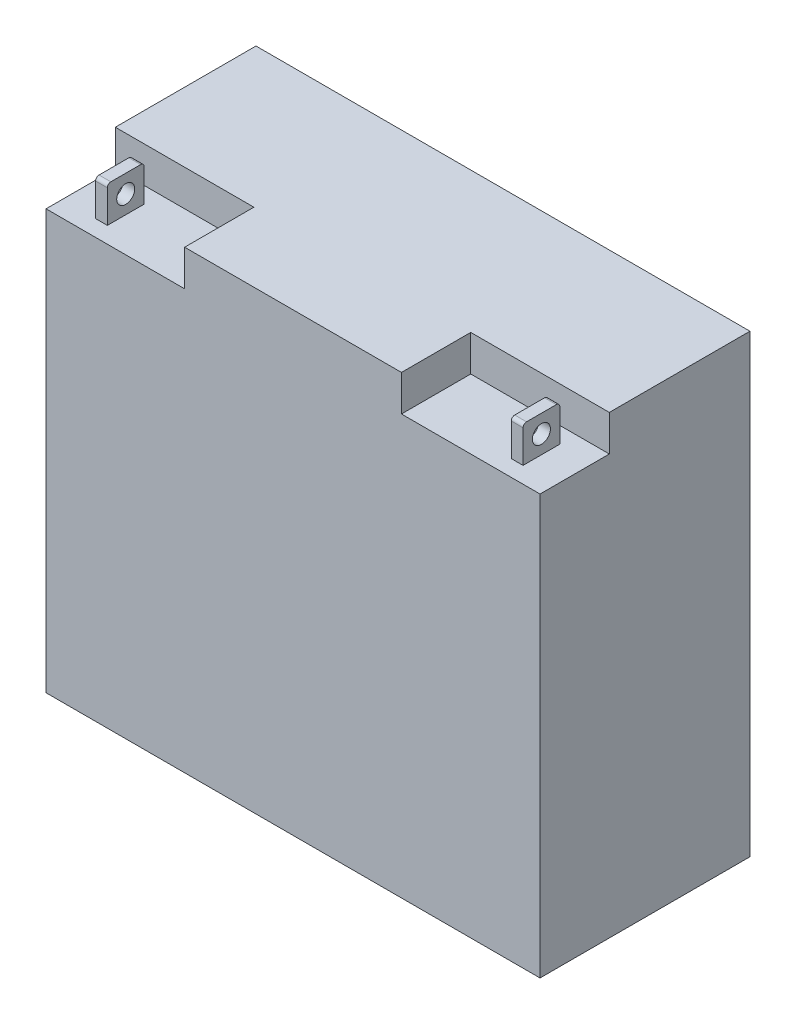
ISO-10303-21;
HEADER;
FILE_DESCRIPTION(('STEP AP214'),'2;1');
FILE_NAME('part.step','',(''),(''),'','','');
FILE_SCHEMA(('AUTOMOTIVE_DESIGN { 1 0 10303 214 1 1 1 1 }'));
ENDSEC;
DATA;
#1=APPLICATION_CONTEXT('core data for automotive mechanical design processes');
#2=APPLICATION_PROTOCOL_DEFINITION('international standard','automotive_design',2000,#1);
#3=PRODUCT_CONTEXT('',#1,'mechanical');
#4=PRODUCT('Part','Part','',(#3));
#5=PRODUCT_RELATED_PRODUCT_CATEGORY('part','',(#4));
#6=PRODUCT_DEFINITION_FORMATION('','',#4);
#7=PRODUCT_DEFINITION_CONTEXT('part definition',#1,'design');
#8=PRODUCT_DEFINITION('design','',#6,#7);
#9=PRODUCT_DEFINITION_SHAPE('','',#8);
#10=(LENGTH_UNIT() NAMED_UNIT(*) SI_UNIT(.MILLI.,.METRE.));
#11=(NAMED_UNIT(*) PLANE_ANGLE_UNIT() SI_UNIT($,.RADIAN.));
#12=(NAMED_UNIT(*) SI_UNIT($,.STERADIAN.) SOLID_ANGLE_UNIT());
#13=UNCERTAINTY_MEASURE_WITH_UNIT(LENGTH_MEASURE(1.E-05),#10,'distance_accuracy_value','');
#14=(GEOMETRIC_REPRESENTATION_CONTEXT(3) GLOBAL_UNCERTAINTY_ASSIGNED_CONTEXT((#13)) GLOBAL_UNIT_ASSIGNED_CONTEXT((#10,
#11,#12)) REPRESENTATION_CONTEXT('',''));
#15=CARTESIAN_POINT('',(0.,0.,0.));
#16=DIRECTION('',(0.,0.,1.));
#17=DIRECTION('',(1.,0.,0.));
#18=AXIS2_PLACEMENT_3D('',#15,#16,#17);
#19=CARTESIAN_POINT('',(90.551,166.878,38.481));
#20=DIRECTION('',(-1.,0.,0.));
#21=DIRECTION('',(0.,0.,1.));
#22=AXIS2_PLACEMENT_3D('',#19,#20,#21);
#23=PLANE('',#22);
#24=DIRECTION('',(0.,0.,-1.));
#25=VECTOR('',#24,1.);
#26=CARTESIAN_POINT('',(90.551,153.67,0.));
#27=LINE('',#26,#25);
#28=CARTESIAN_POINT('',(90.551,153.67,38.481));
#29=VERTEX_POINT('',#28);
#30=CARTESIAN_POINT('',(90.551,153.67,13.081));
#31=VERTEX_POINT('',#30);
#32=EDGE_CURVE('E336',#29,#31,#27,.T.);
#33=ORIENTED_EDGE('',*,*,#32,.F.);
#34=DIRECTION('',(0.,-1.,0.));
#35=VECTOR('',#34,1.);
#36=CARTESIAN_POINT('',(90.551,166.878,38.481));
#37=LINE('',#36,#35);
#38=CARTESIAN_POINT('',(90.551,0.,38.481));
#39=VERTEX_POINT('',#38);
#40=EDGE_CURVE('E359',#29,#39,#37,.T.);
#41=ORIENTED_EDGE('',*,*,#40,.T.);
#42=DIRECTION('',(0.,0.,-1.));
#43=VECTOR('',#42,1.);
#44=CARTESIAN_POINT('',(90.551,0.,38.481));
#45=LINE('',#44,#43);
#46=CARTESIAN_POINT('',(90.551,0.,-38.481));
#47=VERTEX_POINT('',#46);
#48=EDGE_CURVE('E348',#39,#47,#45,.T.);
#49=ORIENTED_EDGE('',*,*,#48,.T.);
#50=DIRECTION('',(0.,-1.,0.));
#51=VECTOR('',#50,1.);
#52=CARTESIAN_POINT('',(90.551,166.878,-38.481));
#53=LINE('',#52,#51);
#54=CARTESIAN_POINT('',(90.551,166.878,-38.481));
#55=VERTEX_POINT('',#54);
#56=EDGE_CURVE('E368',#55,#47,#53,.T.);
#57=ORIENTED_EDGE('',*,*,#56,.F.);
#58=DIRECTION('',(0.,0.,-1.));
#59=VECTOR('',#58,1.);
#60=CARTESIAN_POINT('',(90.551,166.878,38.481));
#61=LINE('',#60,#59);
#62=CARTESIAN_POINT('',(90.551,166.878,13.081));
#63=VERTEX_POINT('',#62);
#64=EDGE_CURVE('E355',#63,#55,#61,.T.);
#65=ORIENTED_EDGE('',*,*,#64,.F.);
#66=DIRECTION('',(0.,1.,0.));
#67=VECTOR('',#66,1.);
#68=CARTESIAN_POINT('',(90.551,153.67,13.081));
#69=LINE('',#68,#67);
#70=EDGE_CURVE('E341',#31,#63,#69,.T.);
#71=ORIENTED_EDGE('',*,*,#70,.F.);
#72=EDGE_LOOP('',(#33,#41,#49,#57,#65,#71));
#73=FACE_BOUND('',#72,.T.);
#74=ADVANCED_FACE('F50',(#73),#23,.F.);
#75=CARTESIAN_POINT('',(0.,166.878,0.));
#76=DIRECTION('',(0.,-1.,0.));
#77=DIRECTION('',(0.,0.,-1.));
#78=AXIS2_PLACEMENT_3D('',#75,#76,#77);
#79=PLANE('',#78);
#80=DIRECTION('',(-1.,0.,0.));
#81=VECTOR('',#80,1.);
#82=CARTESIAN_POINT('',(0.,166.878,13.081));
#83=LINE('',#82,#81);
#84=CARTESIAN_POINT('',(39.751,166.878,13.081));
#85=VERTEX_POINT('',#84);
#86=EDGE_CURVE('E326',#63,#85,#83,.T.);
#87=ORIENTED_EDGE('',*,*,#86,.F.);
#88=ORIENTED_EDGE('',*,*,#64,.T.);
#89=DIRECTION('',(-1.,0.,0.));
#90=VECTOR('',#89,1.);
#91=CARTESIAN_POINT('',(-90.551,166.878,-38.481));
#92=LINE('',#91,#90);
#93=CARTESIAN_POINT('',(-90.5509999999999,166.878,-38.4810000000001));
#94=VERTEX_POINT('',#93);
#95=EDGE_CURVE('E353',#55,#94,#92,.T.);
#96=ORIENTED_EDGE('',*,*,#95,.T.);
#97=DIRECTION('',(0.,0.,-1.));
#98=VECTOR('',#97,1.);
#99=CARTESIAN_POINT('',(-90.551,166.878,38.4809999999999));
#100=LINE('',#99,#98);
#101=CARTESIAN_POINT('',(-90.551,166.878,13.0809999999999));
#102=VERTEX_POINT('',#101);
#103=EDGE_CURVE('E267',#102,#94,#100,.T.);
#104=ORIENTED_EDGE('',*,*,#103,.F.);
#105=DIRECTION('',(1.,0.,0.));
#106=VECTOR('',#105,1.);
#107=CARTESIAN_POINT('',(0.,166.878,13.081));
#108=LINE('',#107,#106);
#109=CARTESIAN_POINT('',(-39.751,166.878,13.081));
#110=VERTEX_POINT('',#109);
#111=EDGE_CURVE('E208',#102,#110,#108,.T.);
#112=ORIENTED_EDGE('',*,*,#111,.T.);
#113=DIRECTION('',(0.,0.,1.));
#114=VECTOR('',#113,1.);
#115=CARTESIAN_POINT('',(-39.751,166.878,0.));
#116=LINE('',#115,#114);
#117=CARTESIAN_POINT('',(-39.751,166.878,38.481));
#118=VERTEX_POINT('',#117);
#119=EDGE_CURVE('E247',#110,#118,#116,.T.);
#120=ORIENTED_EDGE('',*,*,#119,.T.);
#121=DIRECTION('',(1.,0.,0.));
#122=VECTOR('',#121,1.);
#123=CARTESIAN_POINT('',(-90.551,166.878,38.481));
#124=LINE('',#123,#122);
#125=CARTESIAN_POINT('',(39.751,166.878,38.481));
#126=VERTEX_POINT('',#125);
#127=EDGE_CURVE('E357',#118,#126,#124,.T.);
#128=ORIENTED_EDGE('',*,*,#127,.T.);
#129=DIRECTION('',(0.,0.,1.));
#130=VECTOR('',#129,1.);
#131=CARTESIAN_POINT('',(39.751,166.878,0.));
#132=LINE('',#131,#130);
#133=EDGE_CURVE('E332',#85,#126,#132,.T.);
#134=ORIENTED_EDGE('',*,*,#133,.F.);
#135=EDGE_LOOP('',(#87,#88,#96,#104,#112,#120,#128,#134));
#136=FACE_BOUND('',#135,.T.);
#137=ADVANCED_FACE('F420',(#136),#79,.F.);
#138=CARTESIAN_POINT('',(-90.551,166.878,38.481));
#139=DIRECTION('',(0.,0.,-1.));
#140=DIRECTION('',(-1.,0.,0.));
#141=AXIS2_PLACEMENT_3D('',#138,#139,#140);
#142=PLANE('',#141);
#143=DIRECTION('',(1.,0.,0.));
#144=VECTOR('',#143,1.);
#145=CARTESIAN_POINT('',(0.,153.67,38.481));
#146=LINE('',#145,#144);
#147=CARTESIAN_POINT('',(39.751,153.67,38.481));
#148=VERTEX_POINT('',#147);
#149=EDGE_CURVE('E337',#148,#29,#146,.T.);
#150=ORIENTED_EDGE('',*,*,#149,.F.);
#151=DIRECTION('',(0.,1.,0.));
#152=VECTOR('',#151,1.);
#153=CARTESIAN_POINT('',(39.751,153.67,38.481));
#154=LINE('',#153,#152);
#155=EDGE_CURVE('E350',#148,#126,#154,.T.);
#156=ORIENTED_EDGE('',*,*,#155,.T.);
#157=ORIENTED_EDGE('',*,*,#127,.F.);
#158=DIRECTION('',(0.,1.,0.));
#159=VECTOR('',#158,1.);
#160=CARTESIAN_POINT('',(-39.751,153.67,38.481));
#161=LINE('',#160,#159);
#162=CARTESIAN_POINT('',(-39.751,153.67,38.481));
#163=VERTEX_POINT('',#162);
#164=EDGE_CURVE('E262',#163,#118,#161,.T.);
#165=ORIENTED_EDGE('',*,*,#164,.F.);
#166=DIRECTION('',(-1.,0.,0.));
#167=VECTOR('',#166,1.);
#168=CARTESIAN_POINT('',(0.,153.67,38.481));
#169=LINE('',#168,#167);
#170=CARTESIAN_POINT('',(-90.551,153.67,38.4809999999999));
#171=VERTEX_POINT('',#170);
#172=EDGE_CURVE('E249',#163,#171,#169,.T.);
#173=ORIENTED_EDGE('',*,*,#172,.T.);
#174=DIRECTION('',(0.,-1.,0.));
#175=VECTOR('',#174,1.);
#176=CARTESIAN_POINT('',(-90.551,166.878,38.4809999999999));
#177=LINE('',#176,#175);
#178=CARTESIAN_POINT('',(-90.551,0.,38.4809999999999));
#179=VERTEX_POINT('',#178);
#180=EDGE_CURVE('E272',#171,#179,#177,.T.);
#181=ORIENTED_EDGE('',*,*,#180,.T.);
#182=DIRECTION('',(1.,0.,0.));
#183=VECTOR('',#182,1.);
#184=CARTESIAN_POINT('',(-90.551,0.,38.481));
#185=LINE('',#184,#183);
#186=EDGE_CURVE('E354',#179,#39,#185,.T.);
#187=ORIENTED_EDGE('',*,*,#186,.T.);
#188=ORIENTED_EDGE('',*,*,#40,.F.);
#189=EDGE_LOOP('',(#150,#156,#157,#165,#173,#181,#187,#188));
#190=FACE_BOUND('',#189,.T.);
#191=ADVANCED_FACE('F428',(#190),#142,.F.);
#192=CARTESIAN_POINT('',(-90.551,166.878,-38.481));
#193=DIRECTION('',(0.,0.,1.));
#194=DIRECTION('',(1.,0.,0.));
#195=AXIS2_PLACEMENT_3D('',#192,#193,#194);
#196=PLANE('',#195);
#197=DIRECTION('',(-1.,0.,0.));
#198=VECTOR('',#197,1.);
#199=CARTESIAN_POINT('',(-90.551,0.,-38.481));
#200=LINE('',#199,#198);
#201=CARTESIAN_POINT('',(-90.5509999999999,0.,-38.4810000000001));
#202=VERTEX_POINT('',#201);
#203=EDGE_CURVE('E361',#47,#202,#200,.T.);
#204=ORIENTED_EDGE('',*,*,#203,.T.);
#205=DIRECTION('',(0.,-1.,0.));
#206=VECTOR('',#205,1.);
#207=CARTESIAN_POINT('',(-90.5509999999999,166.878,-38.4810000000001));
#208=LINE('',#207,#206);
#209=EDGE_CURVE('E277',#94,#202,#208,.T.);
#210=ORIENTED_EDGE('',*,*,#209,.F.);
#211=ORIENTED_EDGE('',*,*,#95,.F.);
#212=ORIENTED_EDGE('',*,*,#56,.T.);
#213=EDGE_LOOP('',(#204,#210,#211,#212));
#214=FACE_BOUND('',#213,.T.);
#215=ADVANCED_FACE('F431',(#214),#196,.F.);
#216=CARTESIAN_POINT('',(0.,0.,0.));
#217=DIRECTION('',(0.,-1.,0.));
#218=DIRECTION('',(0.,0.,-1.));
#219=AXIS2_PLACEMENT_3D('',#216,#217,#218);
#220=PLANE('',#219);
#221=ORIENTED_EDGE('',*,*,#186,.F.);
#222=DIRECTION('',(0.,0.,-1.));
#223=VECTOR('',#222,1.);
#224=CARTESIAN_POINT('',(-90.551,0.,38.4809999999999));
#225=LINE('',#224,#223);
#226=EDGE_CURVE('E261',#179,#202,#225,.T.);
#227=ORIENTED_EDGE('',*,*,#226,.T.);
#228=ORIENTED_EDGE('',*,*,#203,.F.);
#229=ORIENTED_EDGE('',*,*,#48,.F.);
#230=EDGE_LOOP('',(#221,#227,#228,#229));
#231=FACE_BOUND('',#230,.T.);
#232=ADVANCED_FACE('F432',(#231),#220,.T.);
#233=CARTESIAN_POINT('',(0.,153.67,13.081));
#234=DIRECTION('',(0.,0.,-1.));
#235=DIRECTION('',(-1.,0.,0.));
#236=AXIS2_PLACEMENT_3D('',#233,#234,#235);
#237=PLANE('',#236);
#238=ORIENTED_EDGE('',*,*,#86,.T.);
#239=DIRECTION('',(0.,1.,0.));
#240=VECTOR('',#239,1.);
#241=CARTESIAN_POINT('',(39.751,153.67,13.081));
#242=LINE('',#241,#240);
#243=CARTESIAN_POINT('',(39.751,153.67,13.081));
#244=VERTEX_POINT('',#243);
#245=EDGE_CURVE('E342',#244,#85,#242,.T.);
#246=ORIENTED_EDGE('',*,*,#245,.F.);
#247=DIRECTION('',(-1.,0.,0.));
#248=VECTOR('',#247,1.);
#249=CARTESIAN_POINT('',(0.,153.67,13.081));
#250=LINE('',#249,#248);
#251=EDGE_CURVE('E327',#31,#244,#250,.T.);
#252=ORIENTED_EDGE('',*,*,#251,.F.);
#253=ORIENTED_EDGE('',*,*,#70,.T.);
#254=EDGE_LOOP('',(#238,#246,#252,#253));
#255=FACE_BOUND('',#254,.T.);
#256=ADVANCED_FACE('F439',(#255),#237,.F.);
#257=CARTESIAN_POINT('',(39.751,153.67,0.));
#258=DIRECTION('',(-1.,0.,0.));
#259=DIRECTION('',(0.,0.,1.));
#260=AXIS2_PLACEMENT_3D('',#257,#258,#259);
#261=PLANE('',#260);
#262=ORIENTED_EDGE('',*,*,#133,.T.);
#263=ORIENTED_EDGE('',*,*,#155,.F.);
#264=DIRECTION('',(0.,0.,1.));
#265=VECTOR('',#264,1.);
#266=CARTESIAN_POINT('',(39.751,153.67,0.));
#267=LINE('',#266,#265);
#268=EDGE_CURVE('E334',#244,#148,#267,.T.);
#269=ORIENTED_EDGE('',*,*,#268,.F.);
#270=ORIENTED_EDGE('',*,*,#245,.T.);
#271=EDGE_LOOP('',(#262,#263,#269,#270));
#272=FACE_BOUND('',#271,.T.);
#273=ADVANCED_FACE('F444',(#272),#261,.F.);
#274=CARTESIAN_POINT('',(0.,153.67,0.));
#275=DIRECTION('',(0.,1.,0.));
#276=DIRECTION('',(0.,0.,1.));
#277=AXIS2_PLACEMENT_3D('',#274,#275,#276);
#278=PLANE('',#277);
#279=DIRECTION('',(0.,0.,-1.));
#280=VECTOR('',#279,1.);
#281=CARTESIAN_POINT('',(74.041,153.67,0.));
#282=LINE('',#281,#280);
#283=CARTESIAN_POINT('',(74.041,153.67,32.512));
#284=VERTEX_POINT('',#283);
#285=CARTESIAN_POINT('',(74.041,153.67,19.05));
#286=VERTEX_POINT('',#285);
#287=EDGE_CURVE('E305',#284,#286,#282,.T.);
#288=ORIENTED_EDGE('',*,*,#287,.T.);
#289=DIRECTION('',(-1.,0.,0.));
#290=VECTOR('',#289,1.);
#291=CARTESIAN_POINT('',(0.,153.67,19.0500000000001));
#292=LINE('',#291,#290);
#293=CARTESIAN_POINT('',(78.359,153.67,19.05));
#294=VERTEX_POINT('',#293);
#295=EDGE_CURVE('E310',#294,#286,#292,.T.);
#296=ORIENTED_EDGE('',*,*,#295,.F.);
#297=DIRECTION('',(0.,0.,-1.));
#298=VECTOR('',#297,1.);
#299=CARTESIAN_POINT('',(78.359,153.67,0.));
#300=LINE('',#299,#298);
#301=CARTESIAN_POINT('',(78.359,153.67,32.512));
#302=VERTEX_POINT('',#301);
#303=EDGE_CURVE('E317',#302,#294,#300,.T.);
#304=ORIENTED_EDGE('',*,*,#303,.F.);
#305=DIRECTION('',(-1.,0.,0.));
#306=VECTOR('',#305,1.);
#307=CARTESIAN_POINT('',(0.,153.67,32.512));
#308=LINE('',#307,#306);
#309=EDGE_CURVE('E312',#302,#284,#308,.T.);
#310=ORIENTED_EDGE('',*,*,#309,.T.);
#311=EDGE_LOOP('',(#288,#296,#304,#310));
#312=FACE_BOUND('',#311,.T.);
#313=ORIENTED_EDGE('',*,*,#251,.T.);
#314=ORIENTED_EDGE('',*,*,#268,.T.);
#315=ORIENTED_EDGE('',*,*,#149,.T.);
#316=ORIENTED_EDGE('',*,*,#32,.T.);
#317=EDGE_LOOP('',(#313,#314,#315,#316));
#318=FACE_BOUND('',#317,.T.);
#319=ADVANCED_FACE('F399',(#312,#318),#278,.T.);
#320=CARTESIAN_POINT('',(74.041,166.878,0.));
#321=DIRECTION('',(-1.,0.,0.));
#322=DIRECTION('',(0.,0.,1.));
#323=AXIS2_PLACEMENT_3D('',#320,#321,#322);
#324=PLANE('',#323);
#325=CARTESIAN_POINT('',(74.041,160.274,25.781));
#326=DIRECTION('',(-1.,0.,0.));
#327=DIRECTION('',(0.,0.,1.));
#328=AXIS2_PLACEMENT_3D('',#325,#326,#327);
#329=CIRCLE('',#328,3.30199999999999);
#330=CARTESIAN_POINT('',(74.041,160.274,22.479));
#331=VERTEX_POINT('',#330);
#332=EDGE_CURVE('E299',#331,#331,#329,.T.);
#333=ORIENTED_EDGE('',*,*,#332,.F.);
#334=EDGE_LOOP('',(#333));
#335=FACE_BOUND('',#334,.T.);
#336=DIRECTION('',(0.,0.,-1.));
#337=VECTOR('',#336,1.);
#338=CARTESIAN_POINT('',(74.041,166.878,0.));
#339=LINE('',#338,#337);
#340=CARTESIAN_POINT('',(74.041,166.878,31.242));
#341=VERTEX_POINT('',#340);
#342=CARTESIAN_POINT('',(74.041,166.878,20.32));
#343=VERTEX_POINT('',#342);
#344=EDGE_CURVE('E303',#341,#343,#339,.T.);
#345=ORIENTED_EDGE('',*,*,#344,.T.);
#346=CARTESIAN_POINT('',(74.041,165.608,20.32));
#347=DIRECTION('',(-1.,0.,0.));
#348=DIRECTION('',(0.,0.,1.));
#349=AXIS2_PLACEMENT_3D('',#346,#347,#348);
#350=CIRCLE('',#349,1.27);
#351=CARTESIAN_POINT('',(74.041,165.608,19.05));
#352=VERTEX_POINT('',#351);
#353=EDGE_CURVE('E377',#343,#352,#350,.T.);
#354=ORIENTED_EDGE('',*,*,#353,.T.);
#355=DIRECTION('',(0.,-1.,0.));
#356=VECTOR('',#355,1.);
#357=CARTESIAN_POINT('',(74.041,166.878,19.05));
#358=LINE('',#357,#356);
#359=EDGE_CURVE('E309',#352,#286,#358,.T.);
#360=ORIENTED_EDGE('',*,*,#359,.T.);
#361=ORIENTED_EDGE('',*,*,#287,.F.);
#362=DIRECTION('',(0.,-1.,0.));
#363=VECTOR('',#362,1.);
#364=CARTESIAN_POINT('',(74.041,166.878,32.512));
#365=LINE('',#364,#363);
#366=CARTESIAN_POINT('',(74.041,165.608,32.512));
#367=VERTEX_POINT('',#366);
#368=EDGE_CURVE('E328',#367,#284,#365,.T.);
#369=ORIENTED_EDGE('',*,*,#368,.F.);
#370=CARTESIAN_POINT('',(74.041,165.608,31.242));
#371=DIRECTION('',(-1.,0.,0.));
#372=DIRECTION('',(0.,0.,1.));
#373=AXIS2_PLACEMENT_3D('',#370,#371,#372);
#374=CIRCLE('',#373,1.27);
#375=EDGE_CURVE('E376',#367,#341,#374,.T.);
#376=ORIENTED_EDGE('',*,*,#375,.T.);
#377=EDGE_LOOP('',(#345,#354,#360,#361,#369,#376));
#378=FACE_BOUND('',#377,.T.);
#379=ADVANCED_FACE('F393',(#335,#378),#324,.T.);
#380=CARTESIAN_POINT('',(0.,166.878,32.512));
#381=DIRECTION('',(0.,0.,1.));
#382=DIRECTION('',(1.,0.,0.));
#383=AXIS2_PLACEMENT_3D('',#380,#381,#382);
#384=PLANE('',#383);
#385=DIRECTION('',(0.,-1.,0.));
#386=VECTOR('',#385,1.);
#387=CARTESIAN_POINT('',(78.359,166.878,32.512));
#388=LINE('',#387,#386);
#389=CARTESIAN_POINT('',(78.359,165.608,32.512));
#390=VERTEX_POINT('',#389);
#391=EDGE_CURVE('E321',#390,#302,#388,.T.);
#392=ORIENTED_EDGE('',*,*,#391,.F.);
#393=DIRECTION('',(-1.,0.,0.));
#394=VECTOR('',#393,1.);
#395=CARTESIAN_POINT('',(0.,165.608,32.512));
#396=LINE('',#395,#394);
#397=EDGE_CURVE('E11',#390,#367,#396,.T.);
#398=ORIENTED_EDGE('',*,*,#397,.T.);
#399=ORIENTED_EDGE('',*,*,#368,.T.);
#400=ORIENTED_EDGE('',*,*,#309,.F.);
#401=EDGE_LOOP('',(#392,#398,#399,#400));
#402=FACE_BOUND('',#401,.T.);
#403=ADVANCED_FACE('F405',(#402),#384,.T.);
#404=CARTESIAN_POINT('',(78.359,166.878,0.));
#405=DIRECTION('',(-1.,0.,0.));
#406=DIRECTION('',(0.,0.,1.));
#407=AXIS2_PLACEMENT_3D('',#404,#405,#406);
#408=PLANE('',#407);
#409=CARTESIAN_POINT('',(78.359,160.274,25.781));
#410=DIRECTION('',(1.,0.,0.));
#411=DIRECTION('',(0.,0.,-1.));
#412=AXIS2_PLACEMENT_3D('',#409,#410,#411);
#413=CIRCLE('',#412,3.30199999999999);
#414=CARTESIAN_POINT('',(78.359,160.274,22.479));
#415=VERTEX_POINT('',#414);
#416=EDGE_CURVE('E298',#415,#415,#413,.T.);
#417=ORIENTED_EDGE('',*,*,#416,.F.);
#418=EDGE_LOOP('',(#417));
#419=FACE_BOUND('',#418,.T.);
#420=DIRECTION('',(0.,-1.,0.));
#421=VECTOR('',#420,1.);
#422=CARTESIAN_POINT('',(78.359,166.878,19.05));
#423=LINE('',#422,#421);
#424=CARTESIAN_POINT('',(78.359,165.608,19.05));
#425=VERTEX_POINT('',#424);
#426=EDGE_CURVE('E325',#425,#294,#423,.T.);
#427=ORIENTED_EDGE('',*,*,#426,.F.);
#428=CARTESIAN_POINT('',(78.359,165.608,20.32));
#429=DIRECTION('',(-1.,0.,0.));
#430=DIRECTION('',(0.,0.,1.));
#431=AXIS2_PLACEMENT_3D('',#428,#429,#430);
#432=CIRCLE('',#431,1.27);
#433=CARTESIAN_POINT('',(78.359,166.878,20.32));
#434=VERTEX_POINT('',#433);
#435=EDGE_CURVE('E54',#425,#434,#432,.F.);
#436=ORIENTED_EDGE('',*,*,#435,.T.);
#437=DIRECTION('',(0.,0.,-1.));
#438=VECTOR('',#437,1.);
#439=CARTESIAN_POINT('',(78.359,166.878,0.));
#440=LINE('',#439,#438);
#441=CARTESIAN_POINT('',(78.359,166.878,31.242));
#442=VERTEX_POINT('',#441);
#443=EDGE_CURVE('E306',#442,#434,#440,.T.);
#444=ORIENTED_EDGE('',*,*,#443,.F.);
#445=CARTESIAN_POINT('',(78.359,165.608,31.242));
#446=DIRECTION('',(-1.,0.,0.));
#447=DIRECTION('',(0.,0.,1.));
#448=AXIS2_PLACEMENT_3D('',#445,#446,#447);
#449=CIRCLE('',#448,1.27);
#450=EDGE_CURVE('E65',#442,#390,#449,.F.);
#451=ORIENTED_EDGE('',*,*,#450,.T.);
#452=ORIENTED_EDGE('',*,*,#391,.T.);
#453=ORIENTED_EDGE('',*,*,#303,.T.);
#454=EDGE_LOOP('',(#427,#436,#444,#451,#452,#453));
#455=FACE_BOUND('',#454,.T.);
#456=ADVANCED_FACE('F385',(#419,#455),#408,.F.);
#457=CARTESIAN_POINT('',(0.,166.878,19.0500000000001));
#458=DIRECTION('',(0.,0.,1.));
#459=DIRECTION('',(1.,0.,0.));
#460=AXIS2_PLACEMENT_3D('',#457,#458,#459);
#461=PLANE('',#460);
#462=ORIENTED_EDGE('',*,*,#359,.F.);
#463=DIRECTION('',(-1.,0.,0.));
#464=VECTOR('',#463,1.);
#465=CARTESIAN_POINT('',(78.359,165.608,19.05));
#466=LINE('',#465,#464);
#467=EDGE_CURVE('E69',#352,#425,#466,.F.);
#468=ORIENTED_EDGE('',*,*,#467,.T.);
#469=ORIENTED_EDGE('',*,*,#426,.T.);
#470=ORIENTED_EDGE('',*,*,#295,.T.);
#471=EDGE_LOOP('',(#462,#468,#469,#470));
#472=FACE_BOUND('',#471,.T.);
#473=ADVANCED_FACE('F391',(#472),#461,.F.);
#474=CARTESIAN_POINT('',(0.,166.878,0.));
#475=DIRECTION('',(0.,1.,0.));
#476=DIRECTION('',(0.,0.,1.));
#477=AXIS2_PLACEMENT_3D('',#474,#475,#476);
#478=PLANE('',#477);
#479=ORIENTED_EDGE('',*,*,#443,.T.);
#480=DIRECTION('',(-1.,0.,0.));
#481=VECTOR('',#480,1.);
#482=CARTESIAN_POINT('',(74.041,166.878,20.32));
#483=LINE('',#482,#481);
#484=EDGE_CURVE('E373',#434,#343,#483,.T.);
#485=ORIENTED_EDGE('',*,*,#484,.T.);
#486=ORIENTED_EDGE('',*,*,#344,.F.);
#487=DIRECTION('',(-1.,0.,0.));
#488=VECTOR('',#487,1.);
#489=CARTESIAN_POINT('',(0.,166.878,31.242));
#490=LINE('',#489,#488);
#491=EDGE_CURVE('E371',#341,#442,#490,.F.);
#492=ORIENTED_EDGE('',*,*,#491,.T.);
#493=EDGE_LOOP('',(#479,#485,#486,#492));
#494=FACE_BOUND('',#493,.T.);
#495=ADVANCED_FACE('F387',(#494),#478,.T.);
#496=CARTESIAN_POINT('',(65.151,160.274,25.781));
#497=DIRECTION('',(1.,0.,0.));
#498=DIRECTION('',(0.,0.,-1.));
#499=AXIS2_PLACEMENT_3D('',#496,#497,#498);
#500=CYLINDRICAL_SURFACE('',#499,3.30199999999999);
#501=CARTESIAN_POINT('',(74.041,160.274,22.479));
#502=CARTESIAN_POINT('',(74.0859791666667,160.274,22.479));
#503=CARTESIAN_POINT('',(74.1309583333333,160.274,22.479));
#504=CARTESIAN_POINT('',(74.2209166666667,160.274,22.479));
#505=CARTESIAN_POINT('',(74.2658958333333,160.274,22.479));
#506=CARTESIAN_POINT('',(74.3558541666667,160.274,22.479));
#507=CARTESIAN_POINT('',(74.4008333333334,160.274,22.479));
#508=CARTESIAN_POINT('',(74.4907916666667,160.274,22.479));
#509=CARTESIAN_POINT('',(74.5357708333333,160.274,22.479));
#510=CARTESIAN_POINT('',(74.6257291666667,160.274,22.479));
#511=CARTESIAN_POINT('',(74.6707083333334,160.274,22.479));
#512=CARTESIAN_POINT('',(74.7606666666667,160.274,22.479));
#513=CARTESIAN_POINT('',(74.8056458333333,160.274,22.479));
#514=CARTESIAN_POINT('',(74.8956041666667,160.274,22.479));
#515=CARTESIAN_POINT('',(74.9405833333334,160.274,22.479));
#516=CARTESIAN_POINT('',(75.0305416666667,160.274,22.479));
#517=CARTESIAN_POINT('',(75.0755208333333,160.274,22.479));
#518=CARTESIAN_POINT('',(75.1654791666667,160.274,22.479));
#519=CARTESIAN_POINT('',(75.2104583333333,160.274,22.479));
#520=CARTESIAN_POINT('',(75.3004166666667,160.274,22.479));
#521=CARTESIAN_POINT('',(75.3453958333333,160.274,22.479));
#522=CARTESIAN_POINT('',(75.4353541666667,160.274,22.479));
#523=CARTESIAN_POINT('',(75.4803333333333,160.274,22.479));
#524=CARTESIAN_POINT('',(75.5702916666667,160.274,22.479));
#525=CARTESIAN_POINT('',(75.6152708333333,160.274,22.479));
#526=CARTESIAN_POINT('',(75.7052291666667,160.274,22.479));
#527=CARTESIAN_POINT('',(75.7502083333333,160.274,22.479));
#528=CARTESIAN_POINT('',(75.8401666666667,160.274,22.479));
#529=CARTESIAN_POINT('',(75.8851458333334,160.274,22.479));
#530=CARTESIAN_POINT('',(75.9751041666667,160.274,22.479));
#531=CARTESIAN_POINT('',(76.0200833333333,160.274,22.479));
#532=CARTESIAN_POINT('',(76.1100416666667,160.274,22.479));
#533=CARTESIAN_POINT('',(76.1550208333333,160.274,22.479));
#534=CARTESIAN_POINT('',(76.2449791666667,160.274,22.479));
#535=CARTESIAN_POINT('',(76.2899583333333,160.274,22.479));
#536=CARTESIAN_POINT('',(76.3799166666667,160.274,22.479));
#537=CARTESIAN_POINT('',(76.4248958333333,160.274,22.479));
#538=CARTESIAN_POINT('',(76.5148541666667,160.274,22.479));
#539=CARTESIAN_POINT('',(76.5598333333333,160.274,22.479));
#540=CARTESIAN_POINT('',(76.6497916666667,160.274,22.479));
#541=CARTESIAN_POINT('',(76.6947708333333,160.274,22.479));
#542=CARTESIAN_POINT('',(76.7847291666667,160.274,22.479));
#543=CARTESIAN_POINT('',(76.8297083333333,160.274,22.479));
#544=CARTESIAN_POINT('',(76.9196666666667,160.274,22.479));
#545=CARTESIAN_POINT('',(76.9646458333333,160.274,22.479));
#546=CARTESIAN_POINT('',(77.0546041666667,160.274,22.479));
#547=CARTESIAN_POINT('',(77.0995833333333,160.274,22.479));
#548=CARTESIAN_POINT('',(77.1895416666667,160.274,22.479));
#549=CARTESIAN_POINT('',(77.2345208333333,160.274,22.479));
#550=CARTESIAN_POINT('',(77.3244791666667,160.274,22.479));
#551=CARTESIAN_POINT('',(77.3694583333333,160.274,22.479));
#552=CARTESIAN_POINT('',(77.4594166666667,160.274,22.479));
#553=CARTESIAN_POINT('',(77.5043958333333,160.274,22.479));
#554=CARTESIAN_POINT('',(77.5943541666667,160.274,22.479));
#555=CARTESIAN_POINT('',(77.6393333333333,160.274,22.479));
#556=CARTESIAN_POINT('',(77.7292916666667,160.274,22.479));
#557=CARTESIAN_POINT('',(77.7742708333333,160.274,22.479));
#558=CARTESIAN_POINT('',(77.8642291666667,160.274,22.479));
#559=CARTESIAN_POINT('',(77.9092083333333,160.274,22.479));
#560=CARTESIAN_POINT('',(77.9991666666667,160.274,22.479));
#561=CARTESIAN_POINT('',(78.0441458333333,160.274,22.479));
#562=CARTESIAN_POINT('',(78.1341041666667,160.274,22.479));
#563=CARTESIAN_POINT('',(78.1790833333333,160.274,22.479));
#564=CARTESIAN_POINT('',(78.2690416666667,160.274,22.479));
#565=CARTESIAN_POINT('',(78.3140208333333,160.274,22.479));
#566=CARTESIAN_POINT('',(78.359,160.274,22.479));
#567=B_SPLINE_CURVE_WITH_KNOTS('',3,(#501,#502,#503,#504,#505,#506,#507,#508,#509,#510,#511,
#512,#513,#514,#515,#516,#517,#518,#519,#520,#521,#522,#523,#524,#525,#526,#527,#528,#529,#530,
#531,#532,#533,#534,#535,#536,#537,#538,#539,#540,#541,#542,#543,#544,#545,#546,#547,#548,#549,
#550,#551,#552,#553,#554,#555,#556,#557,#558,#559,#560,#561,#562,#563,#564,#565,#566),
.UNSPECIFIED.,.F.,.F.,(4,2,2,2,2,2,2,2,2,2,2,2,2,2,2,2,2,2,2,2,2,2,2,2,2,2,2,2,2,2,2,2,4),(0.,
0.134937500000001,0.269875000000003,0.404812500000004,0.539750000000006,0.674687500000007,
0.809625000000008,0.94456250000001,1.0795,1.2144375,1.349375,1.4843125,1.61925,1.7541875,
1.88912500000001,2.02406249999999,2.15899999999999,2.2939375,2.428875,2.5638125,2.69875,
2.8336875,2.968625,3.1035625,3.23849999999999,3.37343749999999,3.50837499999999,3.6433125,
3.77825,3.9131875,4.048125,4.18306249999999,4.31799999999999),.UNSPECIFIED.);
#568=EDGE_CURVE('BSEAM414',#331,#415,#567,.T.);
#569=ORIENTED_EDGE('',*,*,#332,.T.);
#570=ORIENTED_EDGE('',*,*,#416,.T.);
#571=ORIENTED_EDGE('',*,*,#568,.T.);
#572=ORIENTED_EDGE('',*,*,#568,.F.);
#573=EDGE_LOOP('',(#569,#571,#570,#572));
#574=FACE_BOUND('',#573,.T.);
#575=ADVANCED_FACE('F414',(#574),#500,.F.);
#576=CARTESIAN_POINT('',(0.,165.608,20.3200000000001));
#577=DIRECTION('',(1.,0.,0.));
#578=DIRECTION('',(0.,0.,-1.));
#579=AXIS2_PLACEMENT_3D('',#576,#577,#578);
#580=CYLINDRICAL_SURFACE('',#579,1.27);
#581=ORIENTED_EDGE('',*,*,#435,.F.);
#582=ORIENTED_EDGE('',*,*,#467,.F.);
#583=ORIENTED_EDGE('',*,*,#353,.F.);
#584=ORIENTED_EDGE('',*,*,#484,.F.);
#585=EDGE_LOOP('',(#581,#582,#583,#584));
#586=FACE_BOUND('',#585,.T.);
#587=ADVANCED_FACE('F386',(#586),#580,.T.);
#588=CARTESIAN_POINT('',(0.,165.608,31.242));
#589=DIRECTION('',(-1.,0.,0.));
#590=DIRECTION('',(0.,0.,1.));
#591=AXIS2_PLACEMENT_3D('',#588,#589,#590);
#592=CYLINDRICAL_SURFACE('',#591,1.27);
#593=ORIENTED_EDGE('',*,*,#450,.F.);
#594=ORIENTED_EDGE('',*,*,#491,.F.);
#595=ORIENTED_EDGE('',*,*,#375,.F.);
#596=ORIENTED_EDGE('',*,*,#397,.F.);
#597=EDGE_LOOP('',(#593,#594,#595,#596));
#598=FACE_BOUND('',#597,.T.);
#599=ADVANCED_FACE('F47',(#598),#592,.T.);
#600=CARTESIAN_POINT('',(-90.551,166.878,38.4809999999999));
#601=DIRECTION('',(1.,0.,0.));
#602=DIRECTION('',(0.,0.,1.));
#603=AXIS2_PLACEMENT_3D('',#600,#601,#602);
#604=PLANE('',#603);
#605=DIRECTION('',(0.,0.,-1.));
#606=VECTOR('',#605,1.);
#607=CARTESIAN_POINT('',(-90.551,153.67,0.));
#608=LINE('',#607,#606);
#609=CARTESIAN_POINT('',(-90.551,153.67,13.0809999999999));
#610=VERTEX_POINT('',#609);
#611=EDGE_CURVE('E255',#171,#610,#608,.T.);
#612=ORIENTED_EDGE('',*,*,#611,.T.);
#613=DIRECTION('',(0.,1.,0.));
#614=VECTOR('',#613,1.);
#615=CARTESIAN_POINT('',(-90.551,153.67,13.0809999999999));
#616=LINE('',#615,#614);
#617=EDGE_CURVE('E258',#610,#102,#616,.T.);
#618=ORIENTED_EDGE('',*,*,#617,.T.);
#619=ORIENTED_EDGE('',*,*,#103,.T.);
#620=ORIENTED_EDGE('',*,*,#209,.T.);
#621=ORIENTED_EDGE('',*,*,#226,.F.);
#622=ORIENTED_EDGE('',*,*,#180,.F.);
#623=EDGE_LOOP('',(#612,#618,#619,#620,#621,#622));
#624=FACE_BOUND('',#623,.T.);
#625=ADVANCED_FACE('F407',(#624),#604,.F.);
#626=CARTESIAN_POINT('',(0.,153.67,13.081));
#627=DIRECTION('',(0.,0.,-1.));
#628=DIRECTION('',(1.,0.,0.));
#629=AXIS2_PLACEMENT_3D('',#626,#627,#628);
#630=PLANE('',#629);
#631=ORIENTED_EDGE('',*,*,#111,.F.);
#632=ORIENTED_EDGE('',*,*,#617,.F.);
#633=DIRECTION('',(1.,0.,0.));
#634=VECTOR('',#633,1.);
#635=CARTESIAN_POINT('',(0.,153.67,13.081));
#636=LINE('',#635,#634);
#637=CARTESIAN_POINT('',(-39.751,153.67,13.081));
#638=VERTEX_POINT('',#637);
#639=EDGE_CURVE('E242',#610,#638,#636,.T.);
#640=ORIENTED_EDGE('',*,*,#639,.T.);
#641=DIRECTION('',(0.,1.,0.));
#642=VECTOR('',#641,1.);
#643=CARTESIAN_POINT('',(-39.751,153.67,13.081));
#644=LINE('',#643,#642);
#645=EDGE_CURVE('E253',#638,#110,#644,.T.);
#646=ORIENTED_EDGE('',*,*,#645,.T.);
#647=EDGE_LOOP('',(#631,#632,#640,#646));
#648=FACE_BOUND('',#647,.T.);
#649=ADVANCED_FACE('F415',(#648),#630,.F.);
#650=CARTESIAN_POINT('',(-39.751,153.67,0.));
#651=DIRECTION('',(1.,0.,0.));
#652=DIRECTION('',(0.,0.,1.));
#653=AXIS2_PLACEMENT_3D('',#650,#651,#652);
#654=PLANE('',#653);
#655=ORIENTED_EDGE('',*,*,#119,.F.);
#656=ORIENTED_EDGE('',*,*,#645,.F.);
#657=DIRECTION('',(0.,0.,1.));
#658=VECTOR('',#657,1.);
#659=CARTESIAN_POINT('',(-39.751,153.67,0.));
#660=LINE('',#659,#658);
#661=EDGE_CURVE('E250',#638,#163,#660,.T.);
#662=ORIENTED_EDGE('',*,*,#661,.T.);
#663=ORIENTED_EDGE('',*,*,#164,.T.);
#664=EDGE_LOOP('',(#655,#656,#662,#663));
#665=FACE_BOUND('',#664,.T.);
#666=ADVANCED_FACE('F480',(#665),#654,.F.);
#667=CARTESIAN_POINT('',(0.,153.67,0.));
#668=DIRECTION('',(0.,1.,0.));
#669=DIRECTION('',(0.,0.,1.));
#670=AXIS2_PLACEMENT_3D('',#667,#668,#669);
#671=PLANE('',#670);
#672=DIRECTION('',(0.,0.,-1.));
#673=VECTOR('',#672,1.);
#674=CARTESIAN_POINT('',(-74.041,153.67,0.));
#675=LINE('',#674,#673);
#676=CARTESIAN_POINT('',(-74.041,153.67,32.5119999999999));
#677=VERTEX_POINT('',#676);
#678=CARTESIAN_POINT('',(-74.041,153.67,19.0499999999999));
#679=VERTEX_POINT('',#678);
#680=EDGE_CURVE('E201',#677,#679,#675,.T.);
#681=ORIENTED_EDGE('',*,*,#680,.F.);
#682=DIRECTION('',(1.,0.,0.));
#683=VECTOR('',#682,1.);
#684=CARTESIAN_POINT('',(0.,153.67,32.512));
#685=LINE('',#684,#683);
#686=CARTESIAN_POINT('',(-78.359,153.67,32.5119999999999));
#687=VERTEX_POINT('',#686);
#688=EDGE_CURVE('E211',#687,#677,#685,.T.);
#689=ORIENTED_EDGE('',*,*,#688,.F.);
#690=DIRECTION('',(0.,0.,-1.));
#691=VECTOR('',#690,1.);
#692=CARTESIAN_POINT('',(-78.359,153.67,0.));
#693=LINE('',#692,#691);
#694=CARTESIAN_POINT('',(-78.359,153.67,19.0499999999999));
#695=VERTEX_POINT('',#694);
#696=EDGE_CURVE('E219',#687,#695,#693,.T.);
#697=ORIENTED_EDGE('',*,*,#696,.T.);
#698=DIRECTION('',(1.,0.,0.));
#699=VECTOR('',#698,1.);
#700=CARTESIAN_POINT('',(0.,153.67,19.0500000000001));
#701=LINE('',#700,#699);
#702=EDGE_CURVE('E228',#695,#679,#701,.T.);
#703=ORIENTED_EDGE('',*,*,#702,.T.);
#704=EDGE_LOOP('',(#681,#689,#697,#703));
#705=FACE_BOUND('',#704,.T.);
#706=ORIENTED_EDGE('',*,*,#639,.F.);
#707=ORIENTED_EDGE('',*,*,#611,.F.);
#708=ORIENTED_EDGE('',*,*,#172,.F.);
#709=ORIENTED_EDGE('',*,*,#661,.F.);
#710=EDGE_LOOP('',(#706,#707,#708,#709));
#711=FACE_BOUND('',#710,.T.);
#712=ADVANCED_FACE('F222',(#705,#711),#671,.T.);
#713=CARTESIAN_POINT('',(-74.041,166.878,0.));
#714=DIRECTION('',(1.,0.,0.));
#715=DIRECTION('',(0.,0.,1.));
#716=AXIS2_PLACEMENT_3D('',#713,#714,#715);
#717=PLANE('',#716);
#718=CARTESIAN_POINT('',(-74.041,160.274,25.7809999999999));
#719=DIRECTION('',(-1.,0.,0.));
#720=DIRECTION('',(0.,0.,1.));
#721=AXIS2_PLACEMENT_3D('',#718,#719,#720);
#722=CIRCLE('',#721,3.30199999999999);
#723=CARTESIAN_POINT('',(-74.041,160.274,22.4789999999999));
#724=VERTEX_POINT('',#723);
#725=EDGE_CURVE('E227',#724,#724,#722,.T.);
#726=ORIENTED_EDGE('',*,*,#725,.T.);
#727=EDGE_LOOP('',(#726));
#728=FACE_BOUND('',#727,.T.);
#729=DIRECTION('',(0.,0.,-1.));
#730=VECTOR('',#729,1.);
#731=CARTESIAN_POINT('',(-74.041,166.878,0.));
#732=LINE('',#731,#730);
#733=CARTESIAN_POINT('',(-74.041,166.878,31.2419999999999));
#734=VERTEX_POINT('',#733);
#735=CARTESIAN_POINT('',(-74.041,166.878,20.3199999999999));
#736=VERTEX_POINT('',#735);
#737=EDGE_CURVE('E238',#734,#736,#732,.T.);
#738=ORIENTED_EDGE('',*,*,#737,.F.);
#739=CARTESIAN_POINT('',(-74.041,165.608,31.2419999999999));
#740=DIRECTION('',(-1.,0.,0.));
#741=DIRECTION('',(0.,0.,1.));
#742=AXIS2_PLACEMENT_3D('',#739,#740,#741);
#743=CIRCLE('',#742,1.27);
#744=CARTESIAN_POINT('',(-74.041,165.608,32.5119999999999));
#745=VERTEX_POINT('',#744);
#746=EDGE_CURVE('E210',#745,#734,#743,.T.);
#747=ORIENTED_EDGE('',*,*,#746,.F.);
#748=DIRECTION('',(0.,-1.,0.));
#749=VECTOR('',#748,1.);
#750=CARTESIAN_POINT('',(-74.041,166.878,32.5119999999999));
#751=LINE('',#750,#749);
#752=EDGE_CURVE('E197',#745,#677,#751,.T.);
#753=ORIENTED_EDGE('',*,*,#752,.T.);
#754=ORIENTED_EDGE('',*,*,#680,.T.);
#755=DIRECTION('',(0.,-1.,0.));
#756=VECTOR('',#755,1.);
#757=CARTESIAN_POINT('',(-74.041,166.878,19.0499999999999));
#758=LINE('',#757,#756);
#759=CARTESIAN_POINT('',(-74.041,165.608,19.0499999999999));
#760=VERTEX_POINT('',#759);
#761=EDGE_CURVE('E237',#760,#679,#758,.T.);
#762=ORIENTED_EDGE('',*,*,#761,.F.);
#763=CARTESIAN_POINT('',(-74.041,165.608,20.3199999999999));
#764=DIRECTION('',(-1.,0.,0.));
#765=DIRECTION('',(0.,0.,1.));
#766=AXIS2_PLACEMENT_3D('',#763,#764,#765);
#767=CIRCLE('',#766,1.27);
#768=EDGE_CURVE('E282',#736,#760,#767,.T.);
#769=ORIENTED_EDGE('',*,*,#768,.F.);
#770=EDGE_LOOP('',(#738,#747,#753,#754,#762,#769));
#771=FACE_BOUND('',#770,.T.);
#772=ADVANCED_FACE('F204',(#728,#771),#717,.T.);
#773=CARTESIAN_POINT('',(0.,166.878,32.512));
#774=DIRECTION('',(0.,0.,1.));
#775=DIRECTION('',(-1.,0.,0.));
#776=AXIS2_PLACEMENT_3D('',#773,#774,#775);
#777=PLANE('',#776);
#778=DIRECTION('',(0.,-1.,0.));
#779=VECTOR('',#778,1.);
#780=CARTESIAN_POINT('',(-78.359,166.878,32.5119999999999));
#781=LINE('',#780,#779);
#782=CARTESIAN_POINT('',(-78.359,165.608,32.5119999999999));
#783=VERTEX_POINT('',#782);
#784=EDGE_CURVE('E212',#783,#687,#781,.T.);
#785=ORIENTED_EDGE('',*,*,#784,.T.);
#786=ORIENTED_EDGE('',*,*,#688,.T.);
#787=ORIENTED_EDGE('',*,*,#752,.F.);
#788=DIRECTION('',(1.,0.,0.));
#789=VECTOR('',#788,1.);
#790=CARTESIAN_POINT('',(0.,165.608,32.512));
#791=LINE('',#790,#789);
#792=EDGE_CURVE('E295',#783,#745,#791,.T.);
#793=ORIENTED_EDGE('',*,*,#792,.F.);
#794=EDGE_LOOP('',(#785,#786,#787,#793));
#795=FACE_BOUND('',#794,.T.);
#796=ADVANCED_FACE('F213',(#795),#777,.T.);
#797=CARTESIAN_POINT('',(-78.359,166.878,0.));
#798=DIRECTION('',(1.,0.,0.));
#799=DIRECTION('',(0.,0.,1.));
#800=AXIS2_PLACEMENT_3D('',#797,#798,#799);
#801=PLANE('',#800);
#802=CARTESIAN_POINT('',(-78.359,160.274,25.7809999999999));
#803=DIRECTION('',(1.,0.,0.));
#804=DIRECTION('',(0.,0.,-1.));
#805=AXIS2_PLACEMENT_3D('',#802,#803,#804);
#806=CIRCLE('',#805,3.30199999999999);
#807=CARTESIAN_POINT('',(-78.359,160.274,22.4789999999999));
#808=VERTEX_POINT('',#807);
#809=EDGE_CURVE('E229',#808,#808,#806,.T.);
#810=ORIENTED_EDGE('',*,*,#809,.T.);
#811=EDGE_LOOP('',(#810));
#812=FACE_BOUND('',#811,.T.);
#813=DIRECTION('',(0.,-1.,0.));
#814=VECTOR('',#813,1.);
#815=CARTESIAN_POINT('',(-78.359,166.878,19.0499999999999));
#816=LINE('',#815,#814);
#817=CARTESIAN_POINT('',(-78.359,165.608,19.0499999999999));
#818=VERTEX_POINT('',#817);
#819=EDGE_CURVE('E241',#818,#695,#816,.T.);
#820=ORIENTED_EDGE('',*,*,#819,.T.);
#821=ORIENTED_EDGE('',*,*,#696,.F.);
#822=ORIENTED_EDGE('',*,*,#784,.F.);
#823=CARTESIAN_POINT('',(-78.359,165.608,31.2419999999999));
#824=DIRECTION('',(-1.,0.,0.));
#825=DIRECTION('',(0.,0.,1.));
#826=AXIS2_PLACEMENT_3D('',#823,#824,#825);
#827=CIRCLE('',#826,1.27);
#828=CARTESIAN_POINT('',(-78.359,166.878,31.2419999999999));
#829=VERTEX_POINT('',#828);
#830=EDGE_CURVE('E288',#829,#783,#827,.F.);
#831=ORIENTED_EDGE('',*,*,#830,.F.);
#832=DIRECTION('',(0.,0.,-1.));
#833=VECTOR('',#832,1.);
#834=CARTESIAN_POINT('',(-78.359,166.878,0.));
#835=LINE('',#834,#833);
#836=CARTESIAN_POINT('',(-78.359,166.878,20.3199999999999));
#837=VERTEX_POINT('',#836);
#838=EDGE_CURVE('E231',#829,#837,#835,.T.);
#839=ORIENTED_EDGE('',*,*,#838,.T.);
#840=CARTESIAN_POINT('',(-78.359,165.608,20.3199999999999));
#841=DIRECTION('',(-1.,0.,0.));
#842=DIRECTION('',(0.,0.,1.));
#843=AXIS2_PLACEMENT_3D('',#840,#841,#842);
#844=CIRCLE('',#843,1.27);
#845=EDGE_CURVE('E293',#818,#837,#844,.F.);
#846=ORIENTED_EDGE('',*,*,#845,.F.);
#847=EDGE_LOOP('',(#820,#821,#822,#831,#839,#846));
#848=FACE_BOUND('',#847,.T.);
#849=ADVANCED_FACE('F490',(#812,#848),#801,.F.);
#850=CARTESIAN_POINT('',(0.,166.878,19.0500000000001));
#851=DIRECTION('',(0.,0.,1.));
#852=DIRECTION('',(-1.,0.,0.));
#853=AXIS2_PLACEMENT_3D('',#850,#851,#852);
#854=PLANE('',#853);
#855=ORIENTED_EDGE('',*,*,#761,.T.);
#856=ORIENTED_EDGE('',*,*,#702,.F.);
#857=ORIENTED_EDGE('',*,*,#819,.F.);
#858=DIRECTION('',(1.,0.,0.));
#859=VECTOR('',#858,1.);
#860=CARTESIAN_POINT('',(-78.359,165.608,19.0499999999999));
#861=LINE('',#860,#859);
#862=EDGE_CURVE('E290',#760,#818,#861,.F.);
#863=ORIENTED_EDGE('',*,*,#862,.F.);
#864=EDGE_LOOP('',(#855,#856,#857,#863));
#865=FACE_BOUND('',#864,.T.);
#866=ADVANCED_FACE('F495',(#865),#854,.F.);
#867=CARTESIAN_POINT('',(0.,166.878,0.));
#868=DIRECTION('',(0.,1.,0.));
#869=DIRECTION('',(0.,0.,1.));
#870=AXIS2_PLACEMENT_3D('',#867,#868,#869);
#871=PLANE('',#870);
#872=ORIENTED_EDGE('',*,*,#838,.F.);
#873=DIRECTION('',(1.,0.,0.));
#874=VECTOR('',#873,1.);
#875=CARTESIAN_POINT('',(0.,166.878,31.242));
#876=LINE('',#875,#874);
#877=EDGE_CURVE('E276',#734,#829,#876,.F.);
#878=ORIENTED_EDGE('',*,*,#877,.F.);
#879=ORIENTED_EDGE('',*,*,#737,.T.);
#880=DIRECTION('',(1.,0.,0.));
#881=VECTOR('',#880,1.);
#882=CARTESIAN_POINT('',(-74.041,166.878,20.3199999999999));
#883=LINE('',#882,#881);
#884=EDGE_CURVE('E283',#837,#736,#883,.T.);
#885=ORIENTED_EDGE('',*,*,#884,.F.);
#886=EDGE_LOOP('',(#872,#878,#879,#885));
#887=FACE_BOUND('',#886,.T.);
#888=ADVANCED_FACE('F496',(#887),#871,.T.);
#889=CARTESIAN_POINT('',(-65.151,160.274,25.7809999999999));
#890=DIRECTION('',(-1.,0.,0.));
#891=DIRECTION('',(0.,0.,-1.));
#892=AXIS2_PLACEMENT_3D('',#889,#890,#891);
#893=CYLINDRICAL_SURFACE('',#892,3.30199999999999);
#894=CARTESIAN_POINT('',(-74.041,160.274,22.4789999999999));
#895=CARTESIAN_POINT('',(-74.0859791666667,160.274,22.4789999999999));
#896=CARTESIAN_POINT('',(-74.1309583333333,160.274,22.4789999999999));
#897=CARTESIAN_POINT('',(-74.2209166666667,160.274,22.4789999999999));
#898=CARTESIAN_POINT('',(-74.2658958333333,160.274,22.4789999999999));
#899=CARTESIAN_POINT('',(-74.3558541666667,160.274,22.4789999999999));
#900=CARTESIAN_POINT('',(-74.4008333333334,160.274,22.4789999999999));
#901=CARTESIAN_POINT('',(-74.4907916666667,160.274,22.4789999999999));
#902=CARTESIAN_POINT('',(-74.5357708333333,160.274,22.4789999999999));
#903=CARTESIAN_POINT('',(-74.6257291666667,160.274,22.4789999999999));
#904=CARTESIAN_POINT('',(-74.6707083333334,160.274,22.4789999999999));
#905=CARTESIAN_POINT('',(-74.7606666666667,160.274,22.4789999999999));
#906=CARTESIAN_POINT('',(-74.8056458333333,160.274,22.4789999999999));
#907=CARTESIAN_POINT('',(-74.8956041666667,160.274,22.4789999999999));
#908=CARTESIAN_POINT('',(-74.9405833333334,160.274,22.4789999999999));
#909=CARTESIAN_POINT('',(-75.0305416666667,160.274,22.4789999999999));
#910=CARTESIAN_POINT('',(-75.0755208333334,160.274,22.4789999999999));
#911=CARTESIAN_POINT('',(-75.1654791666667,160.274,22.4789999999999));
#912=CARTESIAN_POINT('',(-75.2104583333333,160.274,22.4789999999999));
#913=CARTESIAN_POINT('',(-75.3004166666667,160.274,22.4789999999999));
#914=CARTESIAN_POINT('',(-75.3453958333333,160.274,22.4789999999999));
#915=CARTESIAN_POINT('',(-75.4353541666667,160.274,22.4789999999999));
#916=CARTESIAN_POINT('',(-75.4803333333333,160.274,22.4789999999999));
#917=CARTESIAN_POINT('',(-75.5702916666667,160.274,22.4789999999999));
#918=CARTESIAN_POINT('',(-75.6152708333333,160.274,22.4789999999999));
#919=CARTESIAN_POINT('',(-75.7052291666667,160.274,22.4789999999999));
#920=CARTESIAN_POINT('',(-75.7502083333333,160.274,22.4789999999999));
#921=CARTESIAN_POINT('',(-75.8401666666667,160.274,22.4789999999999));
#922=CARTESIAN_POINT('',(-75.8851458333334,160.274,22.4789999999999));
#923=CARTESIAN_POINT('',(-75.9751041666667,160.274,22.4789999999999));
#924=CARTESIAN_POINT('',(-76.0200833333333,160.274,22.4789999999999));
#925=CARTESIAN_POINT('',(-76.1100416666667,160.274,22.4789999999999));
#926=CARTESIAN_POINT('',(-76.1550208333334,160.274,22.4789999999999));
#927=CARTESIAN_POINT('',(-76.2449791666667,160.274,22.4789999999999));
#928=CARTESIAN_POINT('',(-76.2899583333333,160.274,22.4789999999999));
#929=CARTESIAN_POINT('',(-76.3799166666667,160.274,22.4789999999999));
#930=CARTESIAN_POINT('',(-76.4248958333334,160.274,22.4789999999999));
#931=CARTESIAN_POINT('',(-76.5148541666667,160.274,22.4789999999999));
#932=CARTESIAN_POINT('',(-76.5598333333334,160.274,22.4789999999999));
#933=CARTESIAN_POINT('',(-76.6497916666667,160.274,22.4789999999999));
#934=CARTESIAN_POINT('',(-76.6947708333334,160.274,22.4789999999999));
#935=CARTESIAN_POINT('',(-76.7847291666667,160.274,22.4789999999999));
#936=CARTESIAN_POINT('',(-76.8297083333334,160.274,22.4789999999999));
#937=CARTESIAN_POINT('',(-76.9196666666667,160.274,22.4789999999999));
#938=CARTESIAN_POINT('',(-76.9646458333334,160.274,22.4789999999999));
#939=CARTESIAN_POINT('',(-77.0546041666667,160.274,22.4789999999999));
#940=CARTESIAN_POINT('',(-77.0995833333333,160.274,22.4789999999999));
#941=CARTESIAN_POINT('',(-77.1895416666667,160.274,22.4789999999999));
#942=CARTESIAN_POINT('',(-77.2345208333333,160.274,22.4789999999999));
#943=CARTESIAN_POINT('',(-77.3244791666667,160.274,22.4789999999999));
#944=CARTESIAN_POINT('',(-77.3694583333334,160.274,22.4789999999999));
#945=CARTESIAN_POINT('',(-77.4594166666667,160.274,22.4789999999999));
#946=CARTESIAN_POINT('',(-77.5043958333333,160.274,22.4789999999999));
#947=CARTESIAN_POINT('',(-77.5943541666667,160.274,22.4789999999999));
#948=CARTESIAN_POINT('',(-77.6393333333334,160.274,22.4789999999999));
#949=CARTESIAN_POINT('',(-77.7292916666667,160.274,22.4789999999999));
#950=CARTESIAN_POINT('',(-77.7742708333333,160.274,22.4789999999999));
#951=CARTESIAN_POINT('',(-77.8642291666667,160.274,22.4789999999999));
#952=CARTESIAN_POINT('',(-77.9092083333334,160.274,22.4789999999999));
#953=CARTESIAN_POINT('',(-77.9991666666667,160.274,22.4789999999999));
#954=CARTESIAN_POINT('',(-78.0441458333334,160.274,22.4789999999999));
#955=CARTESIAN_POINT('',(-78.1341041666667,160.274,22.4789999999999));
#956=CARTESIAN_POINT('',(-78.1790833333334,160.274,22.4789999999999));
#957=CARTESIAN_POINT('',(-78.2690416666667,160.274,22.4789999999999));
#958=CARTESIAN_POINT('',(-78.3140208333334,160.274,22.4789999999999));
#959=CARTESIAN_POINT('',(-78.359,160.274,22.4789999999999));
#960=B_SPLINE_CURVE_WITH_KNOTS('',3,(#894,#895,#896,#897,#898,#899,#900,#901,#902,#903,#904,
#905,#906,#907,#908,#909,#910,#911,#912,#913,#914,#915,#916,#917,#918,#919,#920,#921,#922,#923,
#924,#925,#926,#927,#928,#929,#930,#931,#932,#933,#934,#935,#936,#937,#938,#939,#940,#941,#942,
#943,#944,#945,#946,#947,#948,#949,#950,#951,#952,#953,#954,#955,#956,#957,#958,#959),
.UNSPECIFIED.,.F.,.F.,(4,2,2,2,2,2,2,2,2,2,2,2,2,2,2,2,2,2,2,2,2,2,2,2,2,2,2,2,2,2,2,2,4),(0.,
0.134937500000001,0.269875000000003,0.404812500000004,0.539750000000006,0.674687500000007,
0.809625000000008,0.94456250000001,1.07950000000001,1.21443750000001,1.349375,1.4843125,1.61925,
1.7541875,1.88912500000001,2.02406250000001,2.15900000000001,2.29393750000001,2.42887500000001,
2.56381250000001,2.69875000000001,2.83368750000002,2.96862500000002,3.1035625,3.23850000000001,
3.37343750000001,3.50837500000001,3.64331250000001,3.77825000000001,3.91318750000001,
4.04812500000001,4.18306250000002,4.31800000000002),.UNSPECIFIED.);
#961=EDGE_CURVE('BSEAM475',#724,#808,#960,.T.);
#962=ORIENTED_EDGE('',*,*,#725,.F.);
#963=ORIENTED_EDGE('',*,*,#809,.F.);
#964=ORIENTED_EDGE('',*,*,#961,.T.);
#965=ORIENTED_EDGE('',*,*,#961,.F.);
#966=EDGE_LOOP('',(#962,#964,#963,#965));
#967=FACE_BOUND('',#966,.T.);
#968=ADVANCED_FACE('F475',(#967),#893,.F.);
#969=CARTESIAN_POINT('',(0.,165.608,20.3200000000001));
#970=DIRECTION('',(-1.,0.,0.));
#971=DIRECTION('',(0.,0.,-1.));
#972=AXIS2_PLACEMENT_3D('',#969,#970,#971);
#973=CYLINDRICAL_SURFACE('',#972,1.27);
#974=ORIENTED_EDGE('',*,*,#845,.T.);
#975=ORIENTED_EDGE('',*,*,#884,.T.);
#976=ORIENTED_EDGE('',*,*,#768,.T.);
#977=ORIENTED_EDGE('',*,*,#862,.T.);
#978=EDGE_LOOP('',(#974,#975,#976,#977));
#979=FACE_BOUND('',#978,.T.);
#980=ADVANCED_FACE('F469',(#979),#973,.T.);
#981=CARTESIAN_POINT('',(0.,165.608,31.242));
#982=DIRECTION('',(1.,0.,0.));
#983=DIRECTION('',(0.,0.,1.));
#984=AXIS2_PLACEMENT_3D('',#981,#982,#983);
#985=CYLINDRICAL_SURFACE('',#984,1.27);
#986=ORIENTED_EDGE('',*,*,#830,.T.);
#987=ORIENTED_EDGE('',*,*,#792,.T.);
#988=ORIENTED_EDGE('',*,*,#746,.T.);
#989=ORIENTED_EDGE('',*,*,#877,.T.);
#990=EDGE_LOOP('',(#986,#987,#988,#989));
#991=FACE_BOUND('',#990,.T.);
#992=ADVANCED_FACE('F467',(#991),#985,.T.);
#993=CLOSED_SHELL('',(#74,#137,#191,#215,#232,#256,#273,#319,#379,#403,#456,#473,#495,#575,#587,
#599,#625,#649,#666,#712,#772,#796,#849,#866,#888,#968,#980,#992));
#994=MANIFOLD_SOLID_BREP('B2',#993);
#995=ADVANCED_BREP_SHAPE_REPRESENTATION('',(#18,#994),#14);
#996=SHAPE_DEFINITION_REPRESENTATION(#9,#995);
ENDSEC;
END-ISO-10303-21;
